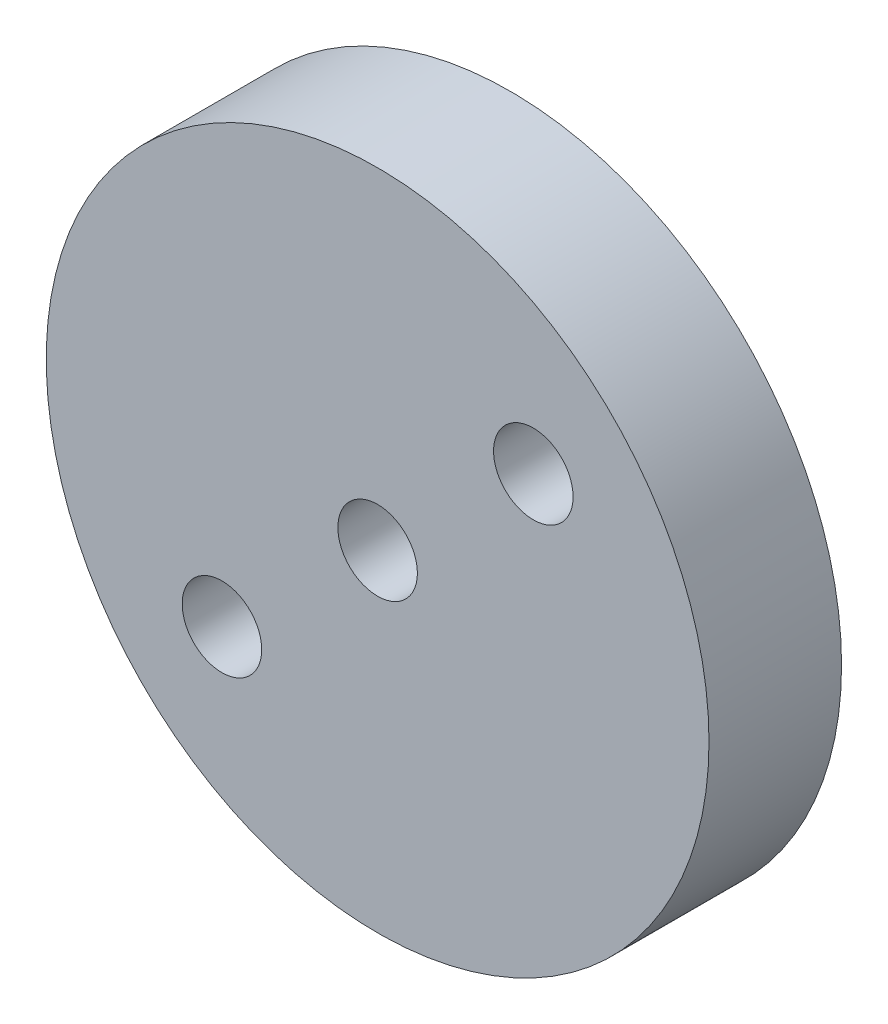
ISO-10303-21;
HEADER;
FILE_DESCRIPTION(('STEP AP214'),'2;1');
FILE_NAME('part.step','',(''),(''),'','','');
FILE_SCHEMA(('AUTOMOTIVE_DESIGN { 1 0 10303 214 1 1 1 1 }'));
ENDSEC;
DATA;
#1=APPLICATION_CONTEXT('core data for automotive mechanical design processes');
#2=APPLICATION_PROTOCOL_DEFINITION('international standard','automotive_design',2000,#1);
#3=PRODUCT_CONTEXT('',#1,'mechanical');
#4=PRODUCT('Part','Part','',(#3));
#5=PRODUCT_RELATED_PRODUCT_CATEGORY('part','',(#4));
#6=PRODUCT_DEFINITION_FORMATION('','',#4);
#7=PRODUCT_DEFINITION_CONTEXT('part definition',#1,'design');
#8=PRODUCT_DEFINITION('design','',#6,#7);
#9=PRODUCT_DEFINITION_SHAPE('','',#8);
#10=(LENGTH_UNIT() NAMED_UNIT(*) SI_UNIT(.MILLI.,.METRE.));
#11=(NAMED_UNIT(*) PLANE_ANGLE_UNIT() SI_UNIT($,.RADIAN.));
#12=(NAMED_UNIT(*) SI_UNIT($,.STERADIAN.) SOLID_ANGLE_UNIT());
#13=UNCERTAINTY_MEASURE_WITH_UNIT(LENGTH_MEASURE(1.E-05),#10,'distance_accuracy_value','');
#14=(GEOMETRIC_REPRESENTATION_CONTEXT(3) GLOBAL_UNCERTAINTY_ASSIGNED_CONTEXT((#13)) GLOBAL_UNIT_ASSIGNED_CONTEXT((#10,
#11,#12)) REPRESENTATION_CONTEXT('',''));
#15=CARTESIAN_POINT('',(0.,0.,0.));
#16=DIRECTION('',(0.,0.,1.));
#17=DIRECTION('',(1.,0.,0.));
#18=AXIS2_PLACEMENT_3D('',#15,#16,#17);
#19=CARTESIAN_POINT('',(0.,0.,5.));
#20=DIRECTION('',(0.,0.,1.));
#21=DIRECTION('',(1.,0.,0.));
#22=AXIS2_PLACEMENT_3D('',#19,#20,#21);
#23=PLANE('',#22);
#24=CARTESIAN_POINT('',(5.87241513202738,5.43274705072267,5.));
#25=DIRECTION('',(0.,0.,1.));
#26=DIRECTION('',(1.,0.,0.));
#27=AXIS2_PLACEMENT_3D('',#24,#25,#26);
#28=CIRCLE('',#27,1.5);
#29=CARTESIAN_POINT('',(7.37241513202737,5.43274705072267,5.));
#30=VERTEX_POINT('',#29);
#31=EDGE_CURVE('E60',#30,#30,#28,.T.);
#32=ORIENTED_EDGE('',*,*,#31,.F.);
#33=EDGE_LOOP('',(#32));
#34=FACE_BOUND('',#33,.T.);
#35=CARTESIAN_POINT('',(0.,0.,5.));
#36=DIRECTION('',(0.,0.,1.));
#37=DIRECTION('',(1.,0.,0.));
#38=AXIS2_PLACEMENT_3D('',#35,#36,#37);
#39=CIRCLE('',#38,12.5);
#40=CARTESIAN_POINT('',(12.5,0.,5.));
#41=VERTEX_POINT('',#40);
#42=EDGE_CURVE('E10',#41,#41,#39,.T.);
#43=ORIENTED_EDGE('',*,*,#42,.T.);
#44=EDGE_LOOP('',(#43));
#45=FACE_BOUND('',#44,.T.);
#46=CARTESIAN_POINT('',(0.,0.,5.));
#47=DIRECTION('',(0.,0.,1.));
#48=DIRECTION('',(1.,0.,0.));
#49=AXIS2_PLACEMENT_3D('',#46,#47,#48);
#50=CIRCLE('',#49,1.49999999999705);
#51=CARTESIAN_POINT('',(1.49999999999705,0.,5.));
#52=VERTEX_POINT('',#51);
#53=EDGE_CURVE('E54',#52,#52,#50,.T.);
#54=ORIENTED_EDGE('',*,*,#53,.F.);
#55=EDGE_LOOP('',(#54));
#56=FACE_BOUND('',#55,.T.);
#57=CARTESIAN_POINT('',(-5.87241513202986,-5.43274705071999,5.));
#58=DIRECTION('',(0.,0.,1.));
#59=DIRECTION('',(1.,0.,0.));
#60=AXIS2_PLACEMENT_3D('',#57,#58,#59);
#61=CIRCLE('',#60,1.5);
#62=CARTESIAN_POINT('',(-4.37241513202986,-5.43274705071999,5.));
#63=VERTEX_POINT('',#62);
#64=EDGE_CURVE('E68',#63,#63,#61,.T.);
#65=ORIENTED_EDGE('',*,*,#64,.F.);
#66=EDGE_LOOP('',(#65));
#67=FACE_BOUND('',#66,.T.);
#68=ADVANCED_FACE('F41',(#34,#45,#56,#67),#23,.T.);
#69=CARTESIAN_POINT('',(0.,0.,0.));
#70=DIRECTION('',(0.,0.,1.));
#71=DIRECTION('',(1.,0.,0.));
#72=AXIS2_PLACEMENT_3D('',#69,#70,#71);
#73=PLANE('',#72);
#74=CARTESIAN_POINT('',(0.,0.,0.));
#75=DIRECTION('',(0.,0.,1.));
#76=DIRECTION('',(1.,0.,0.));
#77=AXIS2_PLACEMENT_3D('',#74,#75,#76);
#78=CIRCLE('',#77,12.5);
#79=CARTESIAN_POINT('',(12.5,0.,0.));
#80=VERTEX_POINT('',#79);
#81=EDGE_CURVE('E45',#80,#80,#78,.T.);
#82=ORIENTED_EDGE('',*,*,#81,.F.);
#83=EDGE_LOOP('',(#82));
#84=FACE_BOUND('',#83,.T.);
#85=CARTESIAN_POINT('',(0.,0.,0.));
#86=DIRECTION('',(0.,0.,1.));
#87=DIRECTION('',(1.,0.,0.));
#88=AXIS2_PLACEMENT_3D('',#85,#86,#87);
#89=CIRCLE('',#88,1.49999999999705);
#90=CARTESIAN_POINT('',(1.49999999999705,0.,0.));
#91=VERTEX_POINT('',#90);
#92=EDGE_CURVE('E56',#91,#91,#89,.T.);
#93=ORIENTED_EDGE('',*,*,#92,.T.);
#94=EDGE_LOOP('',(#93));
#95=FACE_BOUND('',#94,.T.);
#96=CARTESIAN_POINT('',(5.87241513202738,5.43274705072267,0.));
#97=DIRECTION('',(0.,0.,1.));
#98=DIRECTION('',(1.,0.,0.));
#99=AXIS2_PLACEMENT_3D('',#96,#97,#98);
#100=CIRCLE('',#99,1.5);
#101=CARTESIAN_POINT('',(7.37241513202737,5.43274705072267,0.));
#102=VERTEX_POINT('',#101);
#103=EDGE_CURVE('E64',#102,#102,#100,.T.);
#104=ORIENTED_EDGE('',*,*,#103,.T.);
#105=EDGE_LOOP('',(#104));
#106=FACE_BOUND('',#105,.T.);
#107=CARTESIAN_POINT('',(-5.87241513202986,-5.43274705071999,0.));
#108=DIRECTION('',(0.,0.,1.));
#109=DIRECTION('',(1.,0.,0.));
#110=AXIS2_PLACEMENT_3D('',#107,#108,#109);
#111=CIRCLE('',#110,1.5);
#112=CARTESIAN_POINT('',(-4.37241513202986,-5.43274705071999,0.));
#113=VERTEX_POINT('',#112);
#114=EDGE_CURVE('E72',#113,#113,#111,.T.);
#115=ORIENTED_EDGE('',*,*,#114,.T.);
#116=EDGE_LOOP('',(#115));
#117=FACE_BOUND('',#116,.T.);
#118=ADVANCED_FACE('F84',(#84,#95,#106,#117),#73,.F.);
#119=CARTESIAN_POINT('',(0.,0.,5.));
#120=DIRECTION('',(0.,0.,-1.));
#121=DIRECTION('',(-1.,0.,0.));
#122=AXIS2_PLACEMENT_3D('',#119,#120,#121);
#123=CYLINDRICAL_SURFACE('',#122,12.5);
#124=ORIENTED_EDGE('',*,*,#42,.F.);
#125=EDGE_LOOP('',(#124));
#126=FACE_BOUND('',#125,.T.);
#127=ORIENTED_EDGE('',*,*,#81,.T.);
#128=EDGE_LOOP('',(#127));
#129=FACE_BOUND('',#128,.T.);
#130=ADVANCED_FACE('F43',(#126,#129),#123,.T.);
#131=CARTESIAN_POINT('',(0.,0.,5.));
#132=DIRECTION('',(0.,0.,-1.));
#133=DIRECTION('',(-1.,0.,0.));
#134=AXIS2_PLACEMENT_3D('',#131,#132,#133);
#135=CYLINDRICAL_SURFACE('',#134,1.49999999999705);
#136=ORIENTED_EDGE('',*,*,#53,.T.);
#137=EDGE_LOOP('',(#136));
#138=FACE_BOUND('',#137,.T.);
#139=ORIENTED_EDGE('',*,*,#92,.F.);
#140=EDGE_LOOP('',(#139));
#141=FACE_BOUND('',#140,.T.);
#142=ADVANCED_FACE('F93',(#138,#141),#135,.F.);
#143=CARTESIAN_POINT('',(5.87241513202738,5.43274705072267,5.));
#144=DIRECTION('',(0.,0.,-1.));
#145=DIRECTION('',(-1.,0.,0.));
#146=AXIS2_PLACEMENT_3D('',#143,#144,#145);
#147=CYLINDRICAL_SURFACE('',#146,1.5);
#148=ORIENTED_EDGE('',*,*,#31,.T.);
#149=EDGE_LOOP('',(#148));
#150=FACE_BOUND('',#149,.T.);
#151=ORIENTED_EDGE('',*,*,#103,.F.);
#152=EDGE_LOOP('',(#151));
#153=FACE_BOUND('',#152,.T.);
#154=ADVANCED_FACE('F96',(#150,#153),#147,.F.);
#155=CARTESIAN_POINT('',(-5.87241513202986,-5.43274705071999,5.));
#156=DIRECTION('',(0.,0.,-1.));
#157=DIRECTION('',(-1.,0.,0.));
#158=AXIS2_PLACEMENT_3D('',#155,#156,#157);
#159=CYLINDRICAL_SURFACE('',#158,1.5);
#160=ORIENTED_EDGE('',*,*,#64,.T.);
#161=EDGE_LOOP('',(#160));
#162=FACE_BOUND('',#161,.T.);
#163=ORIENTED_EDGE('',*,*,#114,.F.);
#164=EDGE_LOOP('',(#163));
#165=FACE_BOUND('',#164,.T.);
#166=ADVANCED_FACE('F80',(#162,#165),#159,.F.);
#167=CLOSED_SHELL('',(#68,#118,#130,#142,#154,#166));
#168=MANIFOLD_SOLID_BREP('B2',#167);
#169=ADVANCED_BREP_SHAPE_REPRESENTATION('',(#18,#168),#14);
#170=SHAPE_DEFINITION_REPRESENTATION(#9,#169);
ENDSEC;
END-ISO-10303-21;
